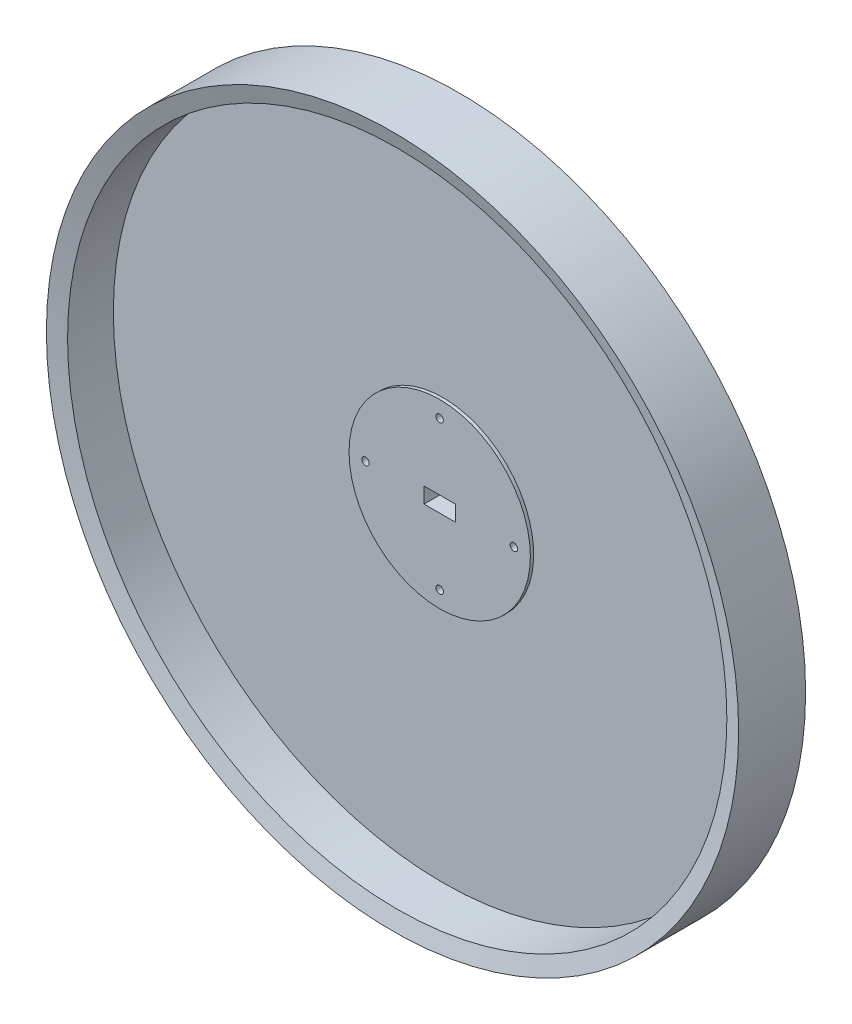
ISO-10303-21;
HEADER;
FILE_DESCRIPTION(('STEP AP214'),'2;1');
FILE_NAME('part.step','',(''),(''),'','','');
FILE_SCHEMA(('AUTOMOTIVE_DESIGN { 1 0 10303 214 1 1 1 1 }'));
ENDSEC;
DATA;
#1=APPLICATION_CONTEXT('core data for automotive mechanical design processes');
#2=APPLICATION_PROTOCOL_DEFINITION('international standard','automotive_design',2000,#1);
#3=PRODUCT_CONTEXT('',#1,'mechanical');
#4=PRODUCT('Part','Part','',(#3));
#5=PRODUCT_RELATED_PRODUCT_CATEGORY('part','',(#4));
#6=PRODUCT_DEFINITION_FORMATION('','',#4);
#7=PRODUCT_DEFINITION_CONTEXT('part definition',#1,'design');
#8=PRODUCT_DEFINITION('design','',#6,#7);
#9=PRODUCT_DEFINITION_SHAPE('','',#8);
#10=(LENGTH_UNIT() NAMED_UNIT(*) SI_UNIT(.MILLI.,.METRE.));
#11=(NAMED_UNIT(*) PLANE_ANGLE_UNIT() SI_UNIT($,.RADIAN.));
#12=(NAMED_UNIT(*) SI_UNIT($,.STERADIAN.) SOLID_ANGLE_UNIT());
#13=UNCERTAINTY_MEASURE_WITH_UNIT(LENGTH_MEASURE(1.E-05),#10,'distance_accuracy_value','');
#14=(GEOMETRIC_REPRESENTATION_CONTEXT(3) GLOBAL_UNCERTAINTY_ASSIGNED_CONTEXT((#13)) GLOBAL_UNIT_ASSIGNED_CONTEXT((#10,
#11,#12)) REPRESENTATION_CONTEXT('',''));
#15=CARTESIAN_POINT('',(0.,0.,0.));
#16=DIRECTION('',(0.,0.,1.));
#17=DIRECTION('',(1.,0.,0.));
#18=AXIS2_PLACEMENT_3D('',#15,#16,#17);
#19=CARTESIAN_POINT('',(0.,0.,-9.99999999999996));
#20=DIRECTION('',(0.,0.,-1.));
#21=DIRECTION('',(-1.,0.,0.));
#22=AXIS2_PLACEMENT_3D('',#19,#20,#21);
#23=CYLINDRICAL_SURFACE('',#22,200.);
#24=CARTESIAN_POINT('',(0.,0.,27.7777777776893));
#25=DIRECTION('',(0.,0.,-1.));
#26=DIRECTION('',(-1.,0.,0.));
#27=AXIS2_PLACEMENT_3D('',#24,#25,#26);
#28=CIRCLE('',#27,200.);
#29=CARTESIAN_POINT('',(-200.,0.,27.7777777776893));
#30=VERTEX_POINT('',#29);
#31=EDGE_CURVE('E176',#30,#30,#28,.T.);
#32=ORIENTED_EDGE('',*,*,#31,.F.);
#33=EDGE_LOOP('',(#32));
#34=FACE_BOUND('',#33,.T.);
#35=CARTESIAN_POINT('',(0.,0.,0.));
#36=DIRECTION('',(0.,0.,-1.));
#37=DIRECTION('',(-1.,0.,0.));
#38=AXIS2_PLACEMENT_3D('',#35,#36,#37);
#39=CIRCLE('',#38,200.);
#40=CARTESIAN_POINT('',(-200.,0.,0.));
#41=VERTEX_POINT('',#40);
#42=EDGE_CURVE('E39',#41,#41,#39,.T.);
#43=ORIENTED_EDGE('',*,*,#42,.T.);
#44=EDGE_LOOP('',(#43));
#45=FACE_BOUND('',#44,.T.);
#46=ADVANCED_FACE('F32',(#34,#45),#23,.F.);
#47=CARTESIAN_POINT('',(0.,0.,0.));
#48=DIRECTION('',(0.,0.,-1.));
#49=DIRECTION('',(-1.,0.,0.));
#50=AXIS2_PLACEMENT_3D('',#47,#48,#49);
#51=PLANE('',#50);
#52=CARTESIAN_POINT('',(0.,0.,0.));
#53=DIRECTION('',(0.,0.,-1.));
#54=DIRECTION('',(-1.,0.,0.));
#55=AXIS2_PLACEMENT_3D('',#52,#53,#54);
#56=CIRCLE('',#55,55.);
#57=CARTESIAN_POINT('',(-55.,0.,0.));
#58=VERTEX_POINT('',#57);
#59=EDGE_CURVE('E11',#58,#58,#56,.F.);
#60=ORIENTED_EDGE('',*,*,#59,.F.);
#61=EDGE_LOOP('',(#60));
#62=FACE_BOUND('',#61,.T.);
#63=ORIENTED_EDGE('',*,*,#42,.F.);
#64=EDGE_LOOP('',(#63));
#65=FACE_BOUND('',#64,.T.);
#66=ADVANCED_FACE('F193',(#62,#65),#51,.F.);
#67=CARTESIAN_POINT('',(210.,0.,-9.99999999999997));
#68=DIRECTION('',(0.,0.,1.));
#69=DIRECTION('',(1.,0.,0.));
#70=AXIS2_PLACEMENT_3D('',#67,#68,#69);
#71=PLANE('',#70);
#72=CARTESIAN_POINT('',(-14.5,15.,-9.99999999999999));
#73=DIRECTION('',(0.,0.,-1.));
#74=DIRECTION('',(-1.,0.,0.));
#75=AXIS2_PLACEMENT_3D('',#72,#73,#74);
#76=CIRCLE('',#75,2.275);
#77=CARTESIAN_POINT('',(-16.775,15.,-9.99999999999999));
#78=VERTEX_POINT('',#77);
#79=EDGE_CURVE('E100',#78,#78,#76,.T.);
#80=ORIENTED_EDGE('',*,*,#79,.F.);
#81=EDGE_LOOP('',(#80));
#82=FACE_BOUND('',#81,.T.);
#83=CARTESIAN_POINT('',(14.5,15.,-9.99999999999999));
#84=DIRECTION('',(0.,0.,-1.));
#85=DIRECTION('',(-1.,0.,0.));
#86=AXIS2_PLACEMENT_3D('',#83,#84,#85);
#87=CIRCLE('',#86,2.275);
#88=CARTESIAN_POINT('',(12.225,15.,-9.99999999999999));
#89=VERTEX_POINT('',#88);
#90=EDGE_CURVE('E93',#89,#89,#87,.T.);
#91=ORIENTED_EDGE('',*,*,#90,.F.);
#92=EDGE_LOOP('',(#91));
#93=FACE_BOUND('',#92,.T.);
#94=CARTESIAN_POINT('',(14.5,-15.,-9.99999999999999));
#95=DIRECTION('',(0.,0.,-1.));
#96=DIRECTION('',(-1.,0.,0.));
#97=AXIS2_PLACEMENT_3D('',#94,#95,#96);
#98=CIRCLE('',#97,2.275);
#99=CARTESIAN_POINT('',(12.225,-15.,-9.99999999999999));
#100=VERTEX_POINT('',#99);
#101=EDGE_CURVE('E109',#100,#100,#98,.T.);
#102=ORIENTED_EDGE('',*,*,#101,.F.);
#103=EDGE_LOOP('',(#102));
#104=FACE_BOUND('',#103,.T.);
#105=CARTESIAN_POINT('',(-14.5,-15.,-9.99999999999999));
#106=DIRECTION('',(0.,0.,-1.));
#107=DIRECTION('',(-1.,0.,0.));
#108=AXIS2_PLACEMENT_3D('',#105,#106,#107);
#109=CIRCLE('',#108,2.275);
#110=CARTESIAN_POINT('',(-16.775,-15.,-9.99999999999999));
#111=VERTEX_POINT('',#110);
#112=EDGE_CURVE('E118',#111,#111,#109,.T.);
#113=ORIENTED_EDGE('',*,*,#112,.F.);
#114=EDGE_LOOP('',(#113));
#115=FACE_BOUND('',#114,.T.);
#116=CARTESIAN_POINT('',(45.,4.71349980743823E-13,-10.));
#117=DIRECTION('',(0.,0.,1.));
#118=DIRECTION('',(1.,0.,0.));
#119=AXIS2_PLACEMENT_3D('',#116,#117,#118);
#120=CIRCLE('',#119,2.25);
#121=CARTESIAN_POINT('',(47.25,4.71349980743823E-13,-10.));
#122=VERTEX_POINT('',#121);
#123=EDGE_CURVE('E130',#122,#122,#120,.T.);
#124=ORIENTED_EDGE('',*,*,#123,.T.);
#125=EDGE_LOOP('',(#124));
#126=FACE_BOUND('',#125,.T.);
#127=CARTESIAN_POINT('',(0.,-45.,-10.));
#128=DIRECTION('',(0.,0.,1.));
#129=DIRECTION('',(1.,0.,0.));
#130=AXIS2_PLACEMENT_3D('',#127,#128,#129);
#131=CIRCLE('',#130,2.24999999999999);
#132=CARTESIAN_POINT('',(2.24999999999999,-45.,-10.));
#133=VERTEX_POINT('',#132);
#134=EDGE_CURVE('E136',#133,#133,#131,.T.);
#135=ORIENTED_EDGE('',*,*,#134,.T.);
#136=EDGE_LOOP('',(#135));
#137=FACE_BOUND('',#136,.T.);
#138=CARTESIAN_POINT('',(-45.,-1.57116660247941E-13,-10.));
#139=DIRECTION('',(0.,0.,1.));
#140=DIRECTION('',(1.,0.,0.));
#141=AXIS2_PLACEMENT_3D('',#138,#139,#140);
#142=CIRCLE('',#141,2.25);
#143=CARTESIAN_POINT('',(-42.75,-1.57116660247941E-13,-10.));
#144=VERTEX_POINT('',#143);
#145=EDGE_CURVE('E142',#144,#144,#142,.T.);
#146=ORIENTED_EDGE('',*,*,#145,.T.);
#147=EDGE_LOOP('',(#146));
#148=FACE_BOUND('',#147,.T.);
#149=CARTESIAN_POINT('',(0.,45.,-10.));
#150=DIRECTION('',(0.,0.,1.));
#151=DIRECTION('',(1.,0.,0.));
#152=AXIS2_PLACEMENT_3D('',#149,#150,#151);
#153=CIRCLE('',#152,2.24999999999999);
#154=CARTESIAN_POINT('',(2.24999999999999,45.,-10.));
#155=VERTEX_POINT('',#154);
#156=EDGE_CURVE('E148',#155,#155,#153,.T.);
#157=ORIENTED_EDGE('',*,*,#156,.T.);
#158=EDGE_LOOP('',(#157));
#159=FACE_BOUND('',#158,.T.);
#160=DIRECTION('',(1.,0.,0.));
#161=VECTOR('',#160,1.);
#162=CARTESIAN_POINT('',(-9.5,-4.75,-10.));
#163=LINE('',#162,#161);
#164=CARTESIAN_POINT('',(-9.5,-4.75,-10.));
#165=VERTEX_POINT('',#164);
#166=CARTESIAN_POINT('',(9.5,-4.75,-10.));
#167=VERTEX_POINT('',#166);
#168=EDGE_CURVE('E171',#165,#167,#163,.T.);
#169=ORIENTED_EDGE('',*,*,#168,.T.);
#170=DIRECTION('',(0.,1.,0.));
#171=VECTOR('',#170,1.);
#172=CARTESIAN_POINT('',(9.5,-4.75,-10.));
#173=LINE('',#172,#171);
#174=CARTESIAN_POINT('',(9.5,4.75,-10.));
#175=VERTEX_POINT('',#174);
#176=EDGE_CURVE('E164',#167,#175,#173,.T.);
#177=ORIENTED_EDGE('',*,*,#176,.T.);
#178=DIRECTION('',(-1.,0.,0.));
#179=VECTOR('',#178,1.);
#180=CARTESIAN_POINT('',(-9.5,4.75,-10.));
#181=LINE('',#180,#179);
#182=CARTESIAN_POINT('',(-9.50000000000001,4.75,-9.99999999999998));
#183=VERTEX_POINT('',#182);
#184=EDGE_CURVE('E167',#175,#183,#181,.T.);
#185=ORIENTED_EDGE('',*,*,#184,.T.);
#186=DIRECTION('',(0.,-1.,0.));
#187=VECTOR('',#186,1.);
#188=CARTESIAN_POINT('',(-9.5,-4.75,-10.));
#189=LINE('',#188,#187);
#190=EDGE_CURVE('E54',#183,#165,#189,.T.);
#191=ORIENTED_EDGE('',*,*,#190,.T.);
#192=EDGE_LOOP('',(#169,#177,#185,#191));
#193=FACE_BOUND('',#192,.T.);
#194=CARTESIAN_POINT('',(0.,0.,-9.99999999999999));
#195=DIRECTION('',(0.,0.,-1.));
#196=DIRECTION('',(-1.,0.,0.));
#197=AXIS2_PLACEMENT_3D('',#194,#195,#196);
#198=CIRCLE('',#197,210.);
#199=CARTESIAN_POINT('',(-210.,0.,-10.));
#200=VERTEX_POINT('',#199);
#201=EDGE_CURVE('E187',#200,#200,#198,.T.);
#202=ORIENTED_EDGE('',*,*,#201,.T.);
#203=EDGE_LOOP('',(#202));
#204=FACE_BOUND('',#203,.T.);
#205=ADVANCED_FACE('F195',(#82,#93,#104,#115,#126,#137,#148,#159,#193,#204),#71,.F.);
#206=CARTESIAN_POINT('',(0.,0.,-9.99999999999996));
#207=DIRECTION('',(0.,0.,-1.));
#208=DIRECTION('',(-1.,0.,0.));
#209=AXIS2_PLACEMENT_3D('',#206,#207,#208);
#210=CYLINDRICAL_SURFACE('',#209,210.);
#211=ORIENTED_EDGE('',*,*,#201,.F.);
#212=EDGE_LOOP('',(#211));
#213=FACE_BOUND('',#212,.T.);
#214=CARTESIAN_POINT('',(0.,0.,30.62499999991));
#215=DIRECTION('',(0.,0.,-1.));
#216=DIRECTION('',(-1.,0.,0.));
#217=AXIS2_PLACEMENT_3D('',#214,#215,#216);
#218=CIRCLE('',#217,210.);
#219=CARTESIAN_POINT('',(-210.,0.,30.62499999991));
#220=VERTEX_POINT('',#219);
#221=EDGE_CURVE('E184',#220,#220,#218,.T.);
#222=ORIENTED_EDGE('',*,*,#221,.T.);
#223=EDGE_LOOP('',(#222));
#224=FACE_BOUND('',#223,.T.);
#225=ADVANCED_FACE('F201',(#213,#224),#210,.T.);
#226=CARTESIAN_POINT('',(0.,0.,27.7777777776893));
#227=DIRECTION('',(0.,0.,1.));
#228=DIRECTION('',(1.,0.,0.));
#229=AXIS2_PLACEMENT_3D('',#226,#227,#228);
#230=CONICAL_SURFACE('',#229,200.,1.29341409872519);
#231=ORIENTED_EDGE('',*,*,#221,.F.);
#232=EDGE_LOOP('',(#231));
#233=FACE_BOUND('',#232,.T.);
#234=ORIENTED_EDGE('',*,*,#31,.T.);
#235=EDGE_LOOP('',(#234));
#236=FACE_BOUND('',#235,.T.);
#237=ADVANCED_FACE('F209',(#233,#236),#230,.F.);
#238=CARTESIAN_POINT('',(9.5,-4.75,-10.));
#239=DIRECTION('',(1.,0.,0.));
#240=DIRECTION('',(0.,0.,-1.));
#241=AXIS2_PLACEMENT_3D('',#238,#239,#240);
#242=PLANE('',#241);
#243=DIRECTION('',(0.,0.,1.));
#244=VECTOR('',#243,1.);
#245=CARTESIAN_POINT('',(9.5,4.75,-10.));
#246=LINE('',#245,#244);
#247=CARTESIAN_POINT('',(9.50000000000001,4.75,2.));
#248=VERTEX_POINT('',#247);
#249=EDGE_CURVE('E46',#175,#248,#246,.T.);
#250=ORIENTED_EDGE('',*,*,#249,.F.);
#251=ORIENTED_EDGE('',*,*,#176,.F.);
#252=DIRECTION('',(0.,0.,1.));
#253=VECTOR('',#252,1.);
#254=CARTESIAN_POINT('',(9.5,-4.75,-10.));
#255=LINE('',#254,#253);
#256=CARTESIAN_POINT('',(9.50000000000001,-4.75,2.));
#257=VERTEX_POINT('',#256);
#258=EDGE_CURVE('E174',#167,#257,#255,.T.);
#259=ORIENTED_EDGE('',*,*,#258,.T.);
#260=DIRECTION('',(0.,1.,0.));
#261=VECTOR('',#260,1.);
#262=CARTESIAN_POINT('',(9.50000000000001,-4.75,2.));
#263=LINE('',#262,#261);
#264=EDGE_CURVE('E151',#257,#248,#263,.T.);
#265=ORIENTED_EDGE('',*,*,#264,.T.);
#266=EDGE_LOOP('',(#250,#251,#259,#265));
#267=FACE_BOUND('',#266,.T.);
#268=ADVANCED_FACE('F213',(#267),#242,.F.);
#269=CARTESIAN_POINT('',(-9.5,-4.75,-10.));
#270=DIRECTION('',(0.,-1.,0.));
#271=DIRECTION('',(0.,0.,-1.));
#272=AXIS2_PLACEMENT_3D('',#269,#270,#271);
#273=PLANE('',#272);
#274=ORIENTED_EDGE('',*,*,#258,.F.);
#275=ORIENTED_EDGE('',*,*,#168,.F.);
#276=DIRECTION('',(0.,0.,1.));
#277=VECTOR('',#276,1.);
#278=CARTESIAN_POINT('',(-9.5,-4.75,-10.));
#279=LINE('',#278,#277);
#280=CARTESIAN_POINT('',(-9.49999999999999,-4.75,2.));
#281=VERTEX_POINT('',#280);
#282=EDGE_CURVE('E177',#165,#281,#279,.T.);
#283=ORIENTED_EDGE('',*,*,#282,.T.);
#284=DIRECTION('',(1.,0.,0.));
#285=VECTOR('',#284,1.);
#286=CARTESIAN_POINT('',(-9.49999999999999,-4.75,2.));
#287=LINE('',#286,#285);
#288=EDGE_CURVE('E158',#281,#257,#287,.T.);
#289=ORIENTED_EDGE('',*,*,#288,.T.);
#290=EDGE_LOOP('',(#274,#275,#283,#289));
#291=FACE_BOUND('',#290,.T.);
#292=ADVANCED_FACE('F217',(#291),#273,.F.);
#293=CARTESIAN_POINT('',(-9.5,-4.75,-10.));
#294=DIRECTION('',(-1.,0.,0.));
#295=DIRECTION('',(0.,0.,1.));
#296=AXIS2_PLACEMENT_3D('',#293,#294,#295);
#297=PLANE('',#296);
#298=ORIENTED_EDGE('',*,*,#282,.F.);
#299=ORIENTED_EDGE('',*,*,#190,.F.);
#300=DIRECTION('',(0.,0.,1.));
#301=VECTOR('',#300,1.);
#302=CARTESIAN_POINT('',(-9.5,4.75,-10.));
#303=LINE('',#302,#301);
#304=CARTESIAN_POINT('',(-9.49999999999999,4.75,2.));
#305=VERTEX_POINT('',#304);
#306=EDGE_CURVE('E179',#183,#305,#303,.T.);
#307=ORIENTED_EDGE('',*,*,#306,.T.);
#308=DIRECTION('',(0.,-1.,0.));
#309=VECTOR('',#308,1.);
#310=CARTESIAN_POINT('',(-9.49999999999999,-4.75,2.));
#311=LINE('',#310,#309);
#312=EDGE_CURVE('E155',#305,#281,#311,.T.);
#313=ORIENTED_EDGE('',*,*,#312,.T.);
#314=EDGE_LOOP('',(#298,#299,#307,#313));
#315=FACE_BOUND('',#314,.T.);
#316=ADVANCED_FACE('F223',(#315),#297,.F.);
#317=CARTESIAN_POINT('',(-9.5,4.75,-10.));
#318=DIRECTION('',(0.,1.,0.));
#319=DIRECTION('',(0.,0.,1.));
#320=AXIS2_PLACEMENT_3D('',#317,#318,#319);
#321=PLANE('',#320);
#322=ORIENTED_EDGE('',*,*,#306,.F.);
#323=ORIENTED_EDGE('',*,*,#184,.F.);
#324=ORIENTED_EDGE('',*,*,#249,.T.);
#325=DIRECTION('',(-1.,0.,0.));
#326=VECTOR('',#325,1.);
#327=CARTESIAN_POINT('',(-9.49999999999999,4.75,2.));
#328=LINE('',#327,#326);
#329=EDGE_CURVE('E153',#248,#305,#328,.T.);
#330=ORIENTED_EDGE('',*,*,#329,.T.);
#331=EDGE_LOOP('',(#322,#323,#324,#330));
#332=FACE_BOUND('',#331,.T.);
#333=ADVANCED_FACE('F219',(#332),#321,.F.);
#334=CARTESIAN_POINT('',(0.,0.,2.));
#335=DIRECTION('',(0.,0.,-1.));
#336=DIRECTION('',(-1.,0.,0.));
#337=AXIS2_PLACEMENT_3D('',#334,#335,#336);
#338=CYLINDRICAL_SURFACE('',#337,55.);
#339=CARTESIAN_POINT('',(0.,0.,2.));
#340=DIRECTION('',(0.,0.,1.));
#341=DIRECTION('',(1.,0.,0.));
#342=AXIS2_PLACEMENT_3D('',#339,#340,#341);
#343=CIRCLE('',#342,55.);
#344=CARTESIAN_POINT('',(55.,0.,2.));
#345=VERTEX_POINT('',#344);
#346=EDGE_CURVE('E161',#345,#345,#343,.T.);
#347=ORIENTED_EDGE('',*,*,#346,.F.);
#348=EDGE_LOOP('',(#347));
#349=FACE_BOUND('',#348,.T.);
#350=ORIENTED_EDGE('',*,*,#59,.T.);
#351=EDGE_LOOP('',(#350));
#352=FACE_BOUND('',#351,.T.);
#353=ADVANCED_FACE('F222',(#349,#352),#338,.T.);
#354=CARTESIAN_POINT('',(0.,0.,2.));
#355=DIRECTION('',(0.,0.,1.));
#356=DIRECTION('',(1.,0.,0.));
#357=AXIS2_PLACEMENT_3D('',#354,#355,#356);
#358=PLANE('',#357);
#359=CARTESIAN_POINT('',(45.,4.71349980743823E-13,2.));
#360=DIRECTION('',(0.,0.,1.));
#361=DIRECTION('',(1.,0.,0.));
#362=AXIS2_PLACEMENT_3D('',#359,#360,#361);
#363=CIRCLE('',#362,2.24999999999999);
#364=CARTESIAN_POINT('',(47.25,4.71349980743823E-13,2.));
#365=VERTEX_POINT('',#364);
#366=EDGE_CURVE('E127',#365,#365,#363,.T.);
#367=ORIENTED_EDGE('',*,*,#366,.F.);
#368=EDGE_LOOP('',(#367));
#369=FACE_BOUND('',#368,.T.);
#370=CARTESIAN_POINT('',(0.,-45.,2.));
#371=DIRECTION('',(0.,0.,1.));
#372=DIRECTION('',(1.,0.,0.));
#373=AXIS2_PLACEMENT_3D('',#370,#371,#372);
#374=CIRCLE('',#373,2.24999999999999);
#375=CARTESIAN_POINT('',(2.24999999999999,-45.,2.));
#376=VERTEX_POINT('',#375);
#377=EDGE_CURVE('E133',#376,#376,#374,.T.);
#378=ORIENTED_EDGE('',*,*,#377,.F.);
#379=EDGE_LOOP('',(#378));
#380=FACE_BOUND('',#379,.T.);
#381=CARTESIAN_POINT('',(-45.,-1.57116660247941E-13,2.));
#382=DIRECTION('',(0.,0.,1.));
#383=DIRECTION('',(1.,0.,0.));
#384=AXIS2_PLACEMENT_3D('',#381,#382,#383);
#385=CIRCLE('',#384,2.24999999999999);
#386=CARTESIAN_POINT('',(-42.75,-1.57116660247941E-13,2.));
#387=VERTEX_POINT('',#386);
#388=EDGE_CURVE('E139',#387,#387,#385,.T.);
#389=ORIENTED_EDGE('',*,*,#388,.F.);
#390=EDGE_LOOP('',(#389));
#391=FACE_BOUND('',#390,.T.);
#392=CARTESIAN_POINT('',(0.,45.,2.));
#393=DIRECTION('',(0.,0.,1.));
#394=DIRECTION('',(1.,0.,0.));
#395=AXIS2_PLACEMENT_3D('',#392,#393,#394);
#396=CIRCLE('',#395,2.24999999999999);
#397=CARTESIAN_POINT('',(2.24999999999999,45.,2.));
#398=VERTEX_POINT('',#397);
#399=EDGE_CURVE('E145',#398,#398,#396,.T.);
#400=ORIENTED_EDGE('',*,*,#399,.F.);
#401=EDGE_LOOP('',(#400));
#402=FACE_BOUND('',#401,.T.);
#403=ORIENTED_EDGE('',*,*,#264,.F.);
#404=ORIENTED_EDGE('',*,*,#288,.F.);
#405=ORIENTED_EDGE('',*,*,#312,.F.);
#406=ORIENTED_EDGE('',*,*,#329,.F.);
#407=EDGE_LOOP('',(#403,#404,#405,#406));
#408=FACE_BOUND('',#407,.T.);
#409=ORIENTED_EDGE('',*,*,#346,.T.);
#410=EDGE_LOOP('',(#409));
#411=FACE_BOUND('',#410,.T.);
#412=ADVANCED_FACE('F231',(#369,#380,#391,#402,#408,#411),#358,.T.);
#413=CARTESIAN_POINT('',(0.,45.,2.));
#414=DIRECTION('',(0.,0.,1.));
#415=DIRECTION('',(1.,0.,0.));
#416=AXIS2_PLACEMENT_3D('',#413,#414,#415);
#417=CYLINDRICAL_SURFACE('',#416,2.24999999999999);
#418=ORIENTED_EDGE('',*,*,#156,.F.);
#419=EDGE_LOOP('',(#418));
#420=FACE_BOUND('',#419,.T.);
#421=ORIENTED_EDGE('',*,*,#399,.T.);
#422=EDGE_LOOP('',(#421));
#423=FACE_BOUND('',#422,.T.);
#424=ADVANCED_FACE('F235',(#420,#423),#417,.F.);
#425=CARTESIAN_POINT('',(-45.,-1.57116660247941E-13,2.));
#426=DIRECTION('',(0.,0.,1.));
#427=DIRECTION('',(1.,0.,0.));
#428=AXIS2_PLACEMENT_3D('',#425,#426,#427);
#429=CYLINDRICAL_SURFACE('',#428,2.24999999999999);
#430=ORIENTED_EDGE('',*,*,#145,.F.);
#431=EDGE_LOOP('',(#430));
#432=FACE_BOUND('',#431,.T.);
#433=ORIENTED_EDGE('',*,*,#388,.T.);
#434=EDGE_LOOP('',(#433));
#435=FACE_BOUND('',#434,.T.);
#436=ADVANCED_FACE('F239',(#432,#435),#429,.F.);
#437=CARTESIAN_POINT('',(0.,-45.,2.));
#438=DIRECTION('',(0.,0.,1.));
#439=DIRECTION('',(1.,0.,0.));
#440=AXIS2_PLACEMENT_3D('',#437,#438,#439);
#441=CYLINDRICAL_SURFACE('',#440,2.24999999999999);
#442=ORIENTED_EDGE('',*,*,#134,.F.);
#443=EDGE_LOOP('',(#442));
#444=FACE_BOUND('',#443,.T.);
#445=ORIENTED_EDGE('',*,*,#377,.T.);
#446=EDGE_LOOP('',(#445));
#447=FACE_BOUND('',#446,.T.);
#448=ADVANCED_FACE('F243',(#444,#447),#441,.F.);
#449=CARTESIAN_POINT('',(45.,4.71349980743823E-13,2.));
#450=DIRECTION('',(0.,0.,1.));
#451=DIRECTION('',(1.,0.,0.));
#452=AXIS2_PLACEMENT_3D('',#449,#450,#451);
#453=CYLINDRICAL_SURFACE('',#452,2.24999999999999);
#454=ORIENTED_EDGE('',*,*,#123,.F.);
#455=EDGE_LOOP('',(#454));
#456=FACE_BOUND('',#455,.T.);
#457=ORIENTED_EDGE('',*,*,#366,.T.);
#458=EDGE_LOOP('',(#457));
#459=FACE_BOUND('',#458,.T.);
#460=ADVANCED_FACE('F247',(#456,#459),#453,.F.);
#461=CARTESIAN_POINT('',(-14.5,-15.,0.));
#462=DIRECTION('',(0.,0.,-1.));
#463=DIRECTION('',(-1.,0.,0.));
#464=AXIS2_PLACEMENT_3D('',#461,#462,#463);
#465=CONICAL_SURFACE('',#464,2.24999999999999,1.02974425867665);
#466=CARTESIAN_POINT('',(-14.5,-15.,1.35193639281201));
#467=VERTEX_POINT('',#466);
#468=VERTEX_LOOP('',#467);
#469=FACE_BOUND('',#468,.T.);
#470=CARTESIAN_POINT('',(-14.5,-15.,0.));
#471=DIRECTION('',(0.,0.,-1.));
#472=DIRECTION('',(-1.,0.,0.));
#473=AXIS2_PLACEMENT_3D('',#470,#471,#472);
#474=CIRCLE('',#473,2.24999999999999);
#475=CARTESIAN_POINT('',(-16.75,-15.,0.));
#476=VERTEX_POINT('',#475);
#477=EDGE_CURVE('E124',#476,#476,#474,.T.);
#478=ORIENTED_EDGE('',*,*,#477,.T.);
#479=EDGE_LOOP('',(#478));
#480=FACE_BOUND('',#479,.T.);
#481=ADVANCED_FACE('F251',(#469,#480),#465,.F.);
#482=CARTESIAN_POINT('',(-14.5,-15.,-9.99999999999998));
#483=DIRECTION('',(0.,0.,-1.));
#484=DIRECTION('',(-1.,0.,0.));
#485=AXIS2_PLACEMENT_3D('',#482,#483,#484);
#486=CYLINDRICAL_SURFACE('',#485,2.24999999999999);
#487=ORIENTED_EDGE('',*,*,#477,.F.);
#488=EDGE_LOOP('',(#487));
#489=FACE_BOUND('',#488,.T.);
#490=CARTESIAN_POINT('',(-14.5,-15.,-9.97499999999998));
#491=DIRECTION('',(0.,0.,-1.));
#492=DIRECTION('',(-1.,0.,0.));
#493=AXIS2_PLACEMENT_3D('',#490,#491,#492);
#494=CIRCLE('',#493,2.25);
#495=CARTESIAN_POINT('',(-16.75,-15.,-9.97499999999998));
#496=VERTEX_POINT('',#495);
#497=EDGE_CURVE('E121',#496,#496,#494,.T.);
#498=ORIENTED_EDGE('',*,*,#497,.T.);
#499=EDGE_LOOP('',(#498));
#500=FACE_BOUND('',#499,.T.);
#501=ADVANCED_FACE('F255',(#489,#500),#486,.F.);
#502=CARTESIAN_POINT('',(-14.5,-15.,-9.99999999999999));
#503=DIRECTION('',(0.,0.,-1.));
#504=DIRECTION('',(-1.,0.,0.));
#505=AXIS2_PLACEMENT_3D('',#502,#503,#504);
#506=CONICAL_SURFACE('',#505,2.275,0.785398163397379);
#507=ORIENTED_EDGE('',*,*,#497,.F.);
#508=EDGE_LOOP('',(#507));
#509=FACE_BOUND('',#508,.T.);
#510=ORIENTED_EDGE('',*,*,#112,.T.);
#511=EDGE_LOOP('',(#510));
#512=FACE_BOUND('',#511,.T.);
#513=ADVANCED_FACE('F259',(#509,#512),#506,.F.);
#514=CARTESIAN_POINT('',(14.5,-15.,0.));
#515=DIRECTION('',(0.,0.,-1.));
#516=DIRECTION('',(-1.,0.,0.));
#517=AXIS2_PLACEMENT_3D('',#514,#515,#516);
#518=CONICAL_SURFACE('',#517,2.24999999999999,1.02974425867665);
#519=CARTESIAN_POINT('',(14.5,-15.,1.35193639281201));
#520=VERTEX_POINT('',#519);
#521=VERTEX_LOOP('',#520);
#522=FACE_BOUND('',#521,.T.);
#523=CARTESIAN_POINT('',(14.5,-15.,0.));
#524=DIRECTION('',(0.,0.,-1.));
#525=DIRECTION('',(-1.,0.,0.));
#526=AXIS2_PLACEMENT_3D('',#523,#524,#525);
#527=CIRCLE('',#526,2.24999999999999);
#528=CARTESIAN_POINT('',(12.25,-15.,0.));
#529=VERTEX_POINT('',#528);
#530=EDGE_CURVE('E115',#529,#529,#527,.T.);
#531=ORIENTED_EDGE('',*,*,#530,.T.);
#532=EDGE_LOOP('',(#531));
#533=FACE_BOUND('',#532,.T.);
#534=ADVANCED_FACE('F263',(#522,#533),#518,.F.);
#535=CARTESIAN_POINT('',(14.5,-15.,-9.99999999999998));
#536=DIRECTION('',(0.,0.,-1.));
#537=DIRECTION('',(-1.,0.,0.));
#538=AXIS2_PLACEMENT_3D('',#535,#536,#537);
#539=CYLINDRICAL_SURFACE('',#538,2.25);
#540=ORIENTED_EDGE('',*,*,#530,.F.);
#541=EDGE_LOOP('',(#540));
#542=FACE_BOUND('',#541,.T.);
#543=CARTESIAN_POINT('',(14.5,-15.,-9.97499999999998));
#544=DIRECTION('',(0.,0.,-1.));
#545=DIRECTION('',(-1.,0.,0.));
#546=AXIS2_PLACEMENT_3D('',#543,#544,#545);
#547=CIRCLE('',#546,2.25);
#548=CARTESIAN_POINT('',(12.25,-15.,-9.97499999999998));
#549=VERTEX_POINT('',#548);
#550=EDGE_CURVE('E112',#549,#549,#547,.T.);
#551=ORIENTED_EDGE('',*,*,#550,.T.);
#552=EDGE_LOOP('',(#551));
#553=FACE_BOUND('',#552,.T.);
#554=ADVANCED_FACE('F267',(#542,#553),#539,.F.);
#555=CARTESIAN_POINT('',(14.5,-15.,-9.99999999999999));
#556=DIRECTION('',(0.,0.,-1.));
#557=DIRECTION('',(-1.,0.,0.));
#558=AXIS2_PLACEMENT_3D('',#555,#556,#557);
#559=CONICAL_SURFACE('',#558,2.275,0.785398163397414);
#560=ORIENTED_EDGE('',*,*,#550,.F.);
#561=EDGE_LOOP('',(#560));
#562=FACE_BOUND('',#561,.T.);
#563=ORIENTED_EDGE('',*,*,#101,.T.);
#564=EDGE_LOOP('',(#563));
#565=FACE_BOUND('',#564,.T.);
#566=ADVANCED_FACE('F271',(#562,#565),#559,.F.);
#567=CARTESIAN_POINT('',(14.5,15.,0.));
#568=DIRECTION('',(0.,0.,-1.));
#569=DIRECTION('',(-1.,0.,0.));
#570=AXIS2_PLACEMENT_3D('',#567,#568,#569);
#571=CONICAL_SURFACE('',#570,2.24999999999999,1.02974425867665);
#572=CARTESIAN_POINT('',(14.5,15.,1.35193639281201));
#573=VERTEX_POINT('',#572);
#574=VERTEX_LOOP('',#573);
#575=FACE_BOUND('',#574,.T.);
#576=CARTESIAN_POINT('',(14.5,15.,0.));
#577=DIRECTION('',(0.,0.,-1.));
#578=DIRECTION('',(-1.,0.,0.));
#579=AXIS2_PLACEMENT_3D('',#576,#577,#578);
#580=CIRCLE('',#579,2.24999999999999);
#581=CARTESIAN_POINT('',(12.25,15.,0.));
#582=VERTEX_POINT('',#581);
#583=EDGE_CURVE('E106',#582,#582,#580,.T.);
#584=ORIENTED_EDGE('',*,*,#583,.T.);
#585=EDGE_LOOP('',(#584));
#586=FACE_BOUND('',#585,.T.);
#587=ADVANCED_FACE('F275',(#575,#586),#571,.F.);
#588=CARTESIAN_POINT('',(14.5,15.,-9.99999999999998));
#589=DIRECTION('',(0.,0.,-1.));
#590=DIRECTION('',(-1.,0.,0.));
#591=AXIS2_PLACEMENT_3D('',#588,#589,#590);
#592=CYLINDRICAL_SURFACE('',#591,2.25);
#593=ORIENTED_EDGE('',*,*,#583,.F.);
#594=EDGE_LOOP('',(#593));
#595=FACE_BOUND('',#594,.T.);
#596=CARTESIAN_POINT('',(14.5,15.,-9.97499999999998));
#597=DIRECTION('',(0.,0.,-1.));
#598=DIRECTION('',(-1.,0.,0.));
#599=AXIS2_PLACEMENT_3D('',#596,#597,#598);
#600=CIRCLE('',#599,2.25);
#601=CARTESIAN_POINT('',(12.25,15.,-9.97499999999998));
#602=VERTEX_POINT('',#601);
#603=EDGE_CURVE('E97',#602,#602,#600,.T.);
#604=ORIENTED_EDGE('',*,*,#603,.T.);
#605=EDGE_LOOP('',(#604));
#606=FACE_BOUND('',#605,.T.);
#607=ADVANCED_FACE('F279',(#595,#606),#592,.F.);
#608=CARTESIAN_POINT('',(14.5,15.,-9.99999999999999));
#609=DIRECTION('',(0.,0.,-1.));
#610=DIRECTION('',(-1.,0.,0.));
#611=AXIS2_PLACEMENT_3D('',#608,#609,#610);
#612=CONICAL_SURFACE('',#611,2.275,0.785398163397414);
#613=ORIENTED_EDGE('',*,*,#603,.F.);
#614=EDGE_LOOP('',(#613));
#615=FACE_BOUND('',#614,.T.);
#616=ORIENTED_EDGE('',*,*,#90,.T.);
#617=EDGE_LOOP('',(#616));
#618=FACE_BOUND('',#617,.T.);
#619=ADVANCED_FACE('F87',(#615,#618),#612,.F.);
#620=CARTESIAN_POINT('',(-14.5,15.,0.));
#621=DIRECTION('',(0.,0.,-1.));
#622=DIRECTION('',(-1.,0.,0.));
#623=AXIS2_PLACEMENT_3D('',#620,#621,#622);
#624=CONICAL_SURFACE('',#623,2.24999999999999,1.02974425867665);
#625=CARTESIAN_POINT('',(-14.5,15.,1.35193639281201));
#626=VERTEX_POINT('',#625);
#627=VERTEX_LOOP('',#626);
#628=FACE_BOUND('',#627,.T.);
#629=CARTESIAN_POINT('',(-14.5,15.,0.));
#630=DIRECTION('',(0.,0.,-1.));
#631=DIRECTION('',(-1.,0.,0.));
#632=AXIS2_PLACEMENT_3D('',#629,#630,#631);
#633=CIRCLE('',#632,2.24999999999999);
#634=CARTESIAN_POINT('',(-16.75,15.,0.));
#635=VERTEX_POINT('',#634);
#636=EDGE_CURVE('E91',#635,#635,#633,.T.);
#637=ORIENTED_EDGE('',*,*,#636,.T.);
#638=EDGE_LOOP('',(#637));
#639=FACE_BOUND('',#638,.T.);
#640=ADVANCED_FACE('F83',(#628,#639),#624,.F.);
#641=CARTESIAN_POINT('',(-14.5,15.,-9.99999999999998));
#642=DIRECTION('',(0.,0.,-1.));
#643=DIRECTION('',(-1.,0.,0.));
#644=AXIS2_PLACEMENT_3D('',#641,#642,#643);
#645=CYLINDRICAL_SURFACE('',#644,2.24999999999999);
#646=ORIENTED_EDGE('',*,*,#636,.F.);
#647=EDGE_LOOP('',(#646));
#648=FACE_BOUND('',#647,.T.);
#649=CARTESIAN_POINT('',(-14.5,15.,-9.97499999999998));
#650=DIRECTION('',(0.,0.,-1.));
#651=DIRECTION('',(-1.,0.,0.));
#652=AXIS2_PLACEMENT_3D('',#649,#650,#651);
#653=CIRCLE('',#652,2.25);
#654=CARTESIAN_POINT('',(-16.75,15.,-9.97499999999998));
#655=VERTEX_POINT('',#654);
#656=EDGE_CURVE('E94',#655,#655,#653,.T.);
#657=ORIENTED_EDGE('',*,*,#656,.T.);
#658=EDGE_LOOP('',(#657));
#659=FACE_BOUND('',#658,.T.);
#660=ADVANCED_FACE('F86',(#648,#659),#645,.F.);
#661=CARTESIAN_POINT('',(-14.5,15.,-9.99999999999999));
#662=DIRECTION('',(0.,0.,-1.));
#663=DIRECTION('',(-1.,0.,0.));
#664=AXIS2_PLACEMENT_3D('',#661,#662,#663);
#665=CONICAL_SURFACE('',#664,2.275,0.785398163397379);
#666=ORIENTED_EDGE('',*,*,#656,.F.);
#667=EDGE_LOOP('',(#666));
#668=FACE_BOUND('',#667,.T.);
#669=ORIENTED_EDGE('',*,*,#79,.T.);
#670=EDGE_LOOP('',(#669));
#671=FACE_BOUND('',#670,.T.);
#672=ADVANCED_FACE('F289',(#668,#671),#665,.F.);
#673=CLOSED_SHELL('',(#46,#66,#205,#225,#237,#268,#292,#316,#333,#353,#412,#424,#436,#448,#460,
#481,#501,#513,#534,#554,#566,#587,#607,#619,#640,#660,#672));
#674=MANIFOLD_SOLID_BREP('B2',#673);
#675=ADVANCED_BREP_SHAPE_REPRESENTATION('',(#18,#674),#14);
#676=SHAPE_DEFINITION_REPRESENTATION(#9,#675);
ENDSEC;
END-ISO-10303-21;
